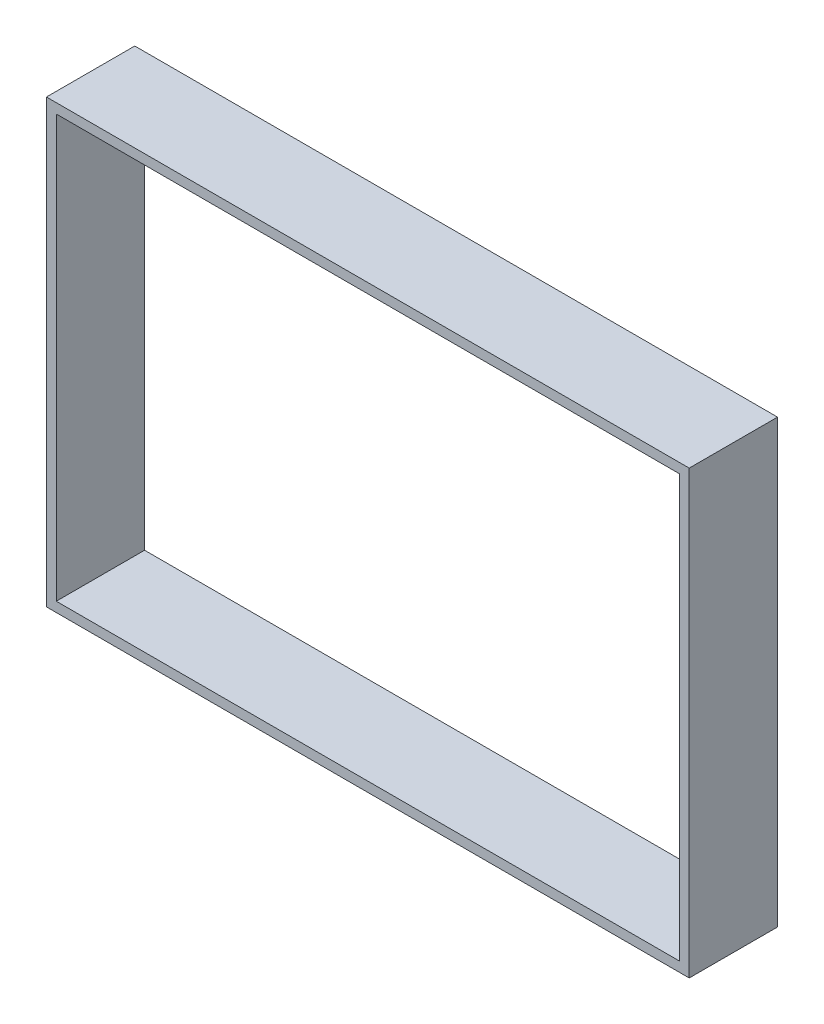
ISO-10303-21;
HEADER;
FILE_DESCRIPTION(('STEP AP214'),'2;1');
FILE_NAME('part.step','',(''),(''),'','','');
FILE_SCHEMA(('AUTOMOTIVE_DESIGN { 1 0 10303 214 1 1 1 1 }'));
ENDSEC;
DATA;
#1=APPLICATION_CONTEXT('core data for automotive mechanical design processes');
#2=APPLICATION_PROTOCOL_DEFINITION('international standard','automotive_design',2000,#1);
#3=PRODUCT_CONTEXT('',#1,'mechanical');
#4=PRODUCT('Part','Part','',(#3));
#5=PRODUCT_RELATED_PRODUCT_CATEGORY('part','',(#4));
#6=PRODUCT_DEFINITION_FORMATION('','',#4);
#7=PRODUCT_DEFINITION_CONTEXT('part definition',#1,'design');
#8=PRODUCT_DEFINITION('design','',#6,#7);
#9=PRODUCT_DEFINITION_SHAPE('','',#8);
#10=(LENGTH_UNIT() NAMED_UNIT(*) SI_UNIT(.MILLI.,.METRE.));
#11=(NAMED_UNIT(*) PLANE_ANGLE_UNIT() SI_UNIT($,.RADIAN.));
#12=(NAMED_UNIT(*) SI_UNIT($,.STERADIAN.) SOLID_ANGLE_UNIT());
#13=UNCERTAINTY_MEASURE_WITH_UNIT(LENGTH_MEASURE(1.E-05),#10,'distance_accuracy_value','');
#14=(GEOMETRIC_REPRESENTATION_CONTEXT(3) GLOBAL_UNCERTAINTY_ASSIGNED_CONTEXT((#13)) GLOBAL_UNIT_ASSIGNED_CONTEXT((#10,
#11,#12)) REPRESENTATION_CONTEXT('',''));
#15=CARTESIAN_POINT('',(0.,0.,0.));
#16=DIRECTION('',(0.,0.,1.));
#17=DIRECTION('',(1.,0.,0.));
#18=AXIS2_PLACEMENT_3D('',#15,#16,#17);
#19=CARTESIAN_POINT('',(0.,0.,18.));
#20=DIRECTION('',(0.,0.,1.));
#21=DIRECTION('',(1.,0.,0.));
#22=AXIS2_PLACEMENT_3D('',#19,#20,#21);
#23=PLANE('',#22);
#24=DIRECTION('',(0.,-1.,0.));
#25=VECTOR('',#24,1.);
#26=CARTESIAN_POINT('',(-70.9068211068211,31.0241956241956,18.));
#27=LINE('',#26,#25);
#28=CARTESIAN_POINT('',(-70.9068211068211,31.0241956241956,18.));
#29=VERTEX_POINT('',#28);
#30=CARTESIAN_POINT('',(-70.9068211068211,-58.9758043758044,18.));
#31=VERTEX_POINT('',#30);
#32=EDGE_CURVE('E157',#29,#31,#27,.T.);
#33=ORIENTED_EDGE('',*,*,#32,.T.);
#34=DIRECTION('',(1.,0.,0.));
#35=VECTOR('',#34,1.);
#36=CARTESIAN_POINT('',(-70.9068211068211,-58.9758043758044,18.));
#37=LINE('',#36,#35);
#38=CARTESIAN_POINT('',(60.0931788931789,-58.9758043758044,18.));
#39=VERTEX_POINT('',#38);
#40=EDGE_CURVE('E161',#31,#39,#37,.T.);
#41=ORIENTED_EDGE('',*,*,#40,.T.);
#42=DIRECTION('',(0.,1.,0.));
#43=VECTOR('',#42,1.);
#44=CARTESIAN_POINT('',(60.0931788931789,31.0241956241956,18.));
#45=LINE('',#44,#43);
#46=CARTESIAN_POINT('',(60.0931788931789,31.0241956241956,18.));
#47=VERTEX_POINT('',#46);
#48=EDGE_CURVE('E165',#39,#47,#45,.T.);
#49=ORIENTED_EDGE('',*,*,#48,.T.);
#50=DIRECTION('',(-1.,0.,0.));
#51=VECTOR('',#50,1.);
#52=CARTESIAN_POINT('',(-70.9068211068211,31.0241956241956,18.));
#53=LINE('',#52,#51);
#54=EDGE_CURVE('E168',#47,#29,#53,.T.);
#55=ORIENTED_EDGE('',*,*,#54,.T.);
#56=EDGE_LOOP('',(#33,#41,#49,#55));
#57=FACE_BOUND('',#56,.T.);
#58=DIRECTION('',(1.,0.,0.));
#59=VECTOR('',#58,1.);
#60=CARTESIAN_POINT('',(-68.9068211068211,-56.9758043758044,18.));
#61=LINE('',#60,#59);
#62=CARTESIAN_POINT('',(-68.9068211068211,-56.9758043758044,18.));
#63=VERTEX_POINT('',#62);
#64=CARTESIAN_POINT('',(58.0931788931789,-56.9758043758044,18.));
#65=VERTEX_POINT('',#64);
#66=EDGE_CURVE('E118',#63,#65,#61,.T.);
#67=ORIENTED_EDGE('',*,*,#66,.F.);
#68=DIRECTION('',(0.,-1.,0.));
#69=VECTOR('',#68,1.);
#70=CARTESIAN_POINT('',(-68.9068211068211,29.0241956241956,18.));
#71=LINE('',#70,#69);
#72=CARTESIAN_POINT('',(-68.9068211068211,29.0241956241956,18.));
#73=VERTEX_POINT('',#72);
#74=EDGE_CURVE('E109',#73,#63,#71,.T.);
#75=ORIENTED_EDGE('',*,*,#74,.F.);
#76=DIRECTION('',(-1.,0.,0.));
#77=VECTOR('',#76,1.);
#78=CARTESIAN_POINT('',(-68.9068211068211,29.0241956241956,18.));
#79=LINE('',#78,#77);
#80=CARTESIAN_POINT('',(58.0931788931789,29.0241956241956,18.));
#81=VERTEX_POINT('',#80);
#82=EDGE_CURVE('E135',#81,#73,#79,.T.);
#83=ORIENTED_EDGE('',*,*,#82,.F.);
#84=DIRECTION('',(0.,1.,0.));
#85=VECTOR('',#84,1.);
#86=CARTESIAN_POINT('',(58.0931788931789,29.0241956241956,18.));
#87=LINE('',#86,#85);
#88=EDGE_CURVE('E131',#65,#81,#87,.T.);
#89=ORIENTED_EDGE('',*,*,#88,.F.);
#90=EDGE_LOOP('',(#67,#75,#83,#89));
#91=FACE_BOUND('',#90,.T.);
#92=ADVANCED_FACE('F43',(#57,#91),#23,.T.);
#93=CARTESIAN_POINT('',(0.,0.,0.));
#94=DIRECTION('',(0.,0.,1.));
#95=DIRECTION('',(1.,0.,0.));
#96=AXIS2_PLACEMENT_3D('',#93,#94,#95);
#97=PLANE('',#96);
#98=DIRECTION('',(0.,-1.,0.));
#99=VECTOR('',#98,1.);
#100=CARTESIAN_POINT('',(-70.9068211068211,31.0241956241956,0.));
#101=LINE('',#100,#99);
#102=CARTESIAN_POINT('',(-70.9068211068211,31.0241956241956,0.));
#103=VERTEX_POINT('',#102);
#104=CARTESIAN_POINT('',(-70.9068211068211,-58.9758043758044,0.));
#105=VERTEX_POINT('',#104);
#106=EDGE_CURVE('E127',#103,#105,#101,.T.);
#107=ORIENTED_EDGE('',*,*,#106,.F.);
#108=DIRECTION('',(-1.,0.,0.));
#109=VECTOR('',#108,1.);
#110=CARTESIAN_POINT('',(-70.9068211068211,31.0241956241956,0.));
#111=LINE('',#110,#109);
#112=CARTESIAN_POINT('',(60.0931788931789,31.0241956241956,0.));
#113=VERTEX_POINT('',#112);
#114=EDGE_CURVE('E162',#113,#103,#111,.T.);
#115=ORIENTED_EDGE('',*,*,#114,.F.);
#116=DIRECTION('',(0.,1.,0.));
#117=VECTOR('',#116,1.);
#118=CARTESIAN_POINT('',(60.0931788931789,31.0241956241956,0.));
#119=LINE('',#118,#117);
#120=CARTESIAN_POINT('',(60.0931788931789,-58.9758043758044,0.));
#121=VERTEX_POINT('',#120);
#122=EDGE_CURVE('E178',#121,#113,#119,.T.);
#123=ORIENTED_EDGE('',*,*,#122,.F.);
#124=DIRECTION('',(1.,0.,0.));
#125=VECTOR('',#124,1.);
#126=CARTESIAN_POINT('',(-70.9068211068211,-58.9758043758044,0.));
#127=LINE('',#126,#125);
#128=EDGE_CURVE('E175',#105,#121,#127,.T.);
#129=ORIENTED_EDGE('',*,*,#128,.F.);
#130=EDGE_LOOP('',(#107,#115,#123,#129));
#131=FACE_BOUND('',#130,.T.);
#132=DIRECTION('',(0.,-1.,0.));
#133=VECTOR('',#132,1.);
#134=CARTESIAN_POINT('',(-68.9068211068211,29.0241956241956,0.));
#135=LINE('',#134,#133);
#136=CARTESIAN_POINT('',(-68.9068211068211,29.0241956241956,0.));
#137=VERTEX_POINT('',#136);
#138=CARTESIAN_POINT('',(-68.9068211068211,-56.9758043758044,0.));
#139=VERTEX_POINT('',#138);
#140=EDGE_CURVE('E67',#137,#139,#135,.T.);
#141=ORIENTED_EDGE('',*,*,#140,.T.);
#142=DIRECTION('',(1.,0.,0.));
#143=VECTOR('',#142,1.);
#144=CARTESIAN_POINT('',(-68.9068211068211,-56.9758043758044,0.));
#145=LINE('',#144,#143);
#146=CARTESIAN_POINT('',(58.0931788931789,-56.9758043758044,0.));
#147=VERTEX_POINT('',#146);
#148=EDGE_CURVE('E125',#139,#147,#145,.T.);
#149=ORIENTED_EDGE('',*,*,#148,.T.);
#150=DIRECTION('',(0.,1.,0.));
#151=VECTOR('',#150,1.);
#152=CARTESIAN_POINT('',(58.0931788931789,29.0241956241956,0.));
#153=LINE('',#152,#151);
#154=CARTESIAN_POINT('',(58.0931788931789,29.0241956241956,0.));
#155=VERTEX_POINT('',#154);
#156=EDGE_CURVE('E144',#147,#155,#153,.T.);
#157=ORIENTED_EDGE('',*,*,#156,.T.);
#158=DIRECTION('',(-1.,0.,0.));
#159=VECTOR('',#158,1.);
#160=CARTESIAN_POINT('',(-68.9068211068211,29.0241956241956,0.));
#161=LINE('',#160,#159);
#162=EDGE_CURVE('E119',#155,#137,#161,.T.);
#163=ORIENTED_EDGE('',*,*,#162,.T.);
#164=EDGE_LOOP('',(#141,#149,#157,#163));
#165=FACE_BOUND('',#164,.T.);
#166=ADVANCED_FACE('F201',(#131,#165),#97,.F.);
#167=CARTESIAN_POINT('',(-70.9068211068211,31.0241956241956,18.));
#168=DIRECTION('',(1.,0.,0.));
#169=DIRECTION('',(0.,1.,0.));
#170=AXIS2_PLACEMENT_3D('',#167,#168,#169);
#171=PLANE('',#170);
#172=ORIENTED_EDGE('',*,*,#106,.T.);
#173=DIRECTION('',(0.,0.,-1.));
#174=VECTOR('',#173,1.);
#175=CARTESIAN_POINT('',(-70.9068211068211,-58.9758043758044,18.));
#176=LINE('',#175,#174);
#177=EDGE_CURVE('E11',#31,#105,#176,.T.);
#178=ORIENTED_EDGE('',*,*,#177,.F.);
#179=ORIENTED_EDGE('',*,*,#32,.F.);
#180=DIRECTION('',(0.,0.,-1.));
#181=VECTOR('',#180,1.);
#182=CARTESIAN_POINT('',(-70.9068211068211,31.0241956241956,18.));
#183=LINE('',#182,#181);
#184=EDGE_CURVE('E171',#29,#103,#183,.T.);
#185=ORIENTED_EDGE('',*,*,#184,.T.);
#186=EDGE_LOOP('',(#172,#178,#179,#185));
#187=FACE_BOUND('',#186,.T.);
#188=ADVANCED_FACE('F45',(#187),#171,.F.);
#189=CARTESIAN_POINT('',(-70.9068211068211,-58.9758043758044,18.));
#190=DIRECTION('',(0.,1.,0.));
#191=DIRECTION('',(0.,0.,1.));
#192=AXIS2_PLACEMENT_3D('',#189,#190,#191);
#193=PLANE('',#192);
#194=ORIENTED_EDGE('',*,*,#128,.T.);
#195=DIRECTION('',(0.,0.,-1.));
#196=VECTOR('',#195,1.);
#197=CARTESIAN_POINT('',(60.0931788931789,-58.9758043758044,18.));
#198=LINE('',#197,#196);
#199=EDGE_CURVE('E52',#39,#121,#198,.T.);
#200=ORIENTED_EDGE('',*,*,#199,.F.);
#201=ORIENTED_EDGE('',*,*,#40,.F.);
#202=ORIENTED_EDGE('',*,*,#177,.T.);
#203=EDGE_LOOP('',(#194,#200,#201,#202));
#204=FACE_BOUND('',#203,.T.);
#205=ADVANCED_FACE('F211',(#204),#193,.F.);
#206=CARTESIAN_POINT('',(60.0931788931789,31.0241956241956,18.));
#207=DIRECTION('',(-1.,0.,0.));
#208=DIRECTION('',(0.,-1.,0.));
#209=AXIS2_PLACEMENT_3D('',#206,#207,#208);
#210=PLANE('',#209);
#211=ORIENTED_EDGE('',*,*,#122,.T.);
#212=DIRECTION('',(0.,0.,-1.));
#213=VECTOR('',#212,1.);
#214=CARTESIAN_POINT('',(60.0931788931789,31.0241956241956,18.));
#215=LINE('',#214,#213);
#216=EDGE_CURVE('E186',#47,#113,#215,.T.);
#217=ORIENTED_EDGE('',*,*,#216,.F.);
#218=ORIENTED_EDGE('',*,*,#48,.F.);
#219=ORIENTED_EDGE('',*,*,#199,.T.);
#220=EDGE_LOOP('',(#211,#217,#218,#219));
#221=FACE_BOUND('',#220,.T.);
#222=ADVANCED_FACE('F195',(#221),#210,.F.);
#223=CARTESIAN_POINT('',(-70.9068211068211,31.0241956241956,18.));
#224=DIRECTION('',(0.,-1.,0.));
#225=DIRECTION('',(1.,0.,0.));
#226=AXIS2_PLACEMENT_3D('',#223,#224,#225);
#227=PLANE('',#226);
#228=ORIENTED_EDGE('',*,*,#114,.T.);
#229=ORIENTED_EDGE('',*,*,#184,.F.);
#230=ORIENTED_EDGE('',*,*,#54,.F.);
#231=ORIENTED_EDGE('',*,*,#216,.T.);
#232=EDGE_LOOP('',(#228,#229,#230,#231));
#233=FACE_BOUND('',#232,.T.);
#234=ADVANCED_FACE('F205',(#233),#227,.F.);
#235=CARTESIAN_POINT('',(-68.9068211068211,29.0241956241956,18.));
#236=DIRECTION('',(1.,0.,0.));
#237=DIRECTION('',(0.,1.,0.));
#238=AXIS2_PLACEMENT_3D('',#235,#236,#237);
#239=PLANE('',#238);
#240=ORIENTED_EDGE('',*,*,#140,.F.);
#241=DIRECTION('',(0.,0.,-1.));
#242=VECTOR('',#241,1.);
#243=CARTESIAN_POINT('',(-68.9068211068211,29.0241956241956,18.));
#244=LINE('',#243,#242);
#245=EDGE_CURVE('E113',#73,#137,#244,.T.);
#246=ORIENTED_EDGE('',*,*,#245,.F.);
#247=ORIENTED_EDGE('',*,*,#74,.T.);
#248=DIRECTION('',(0.,0.,-1.));
#249=VECTOR('',#248,1.);
#250=CARTESIAN_POINT('',(-68.9068211068211,-56.9758043758044,18.));
#251=LINE('',#250,#249);
#252=EDGE_CURVE('E112',#63,#139,#251,.T.);
#253=ORIENTED_EDGE('',*,*,#252,.T.);
#254=EDGE_LOOP('',(#240,#246,#247,#253));
#255=FACE_BOUND('',#254,.T.);
#256=ADVANCED_FACE('F111',(#255),#239,.T.);
#257=CARTESIAN_POINT('',(-68.9068211068211,-56.9758043758044,18.));
#258=DIRECTION('',(0.,1.,0.));
#259=DIRECTION('',(0.,0.,1.));
#260=AXIS2_PLACEMENT_3D('',#257,#258,#259);
#261=PLANE('',#260);
#262=ORIENTED_EDGE('',*,*,#148,.F.);
#263=ORIENTED_EDGE('',*,*,#252,.F.);
#264=ORIENTED_EDGE('',*,*,#66,.T.);
#265=DIRECTION('',(0.,0.,-1.));
#266=VECTOR('',#265,1.);
#267=CARTESIAN_POINT('',(58.0931788931789,-56.9758043758044,18.));
#268=LINE('',#267,#266);
#269=EDGE_CURVE('E128',#65,#147,#268,.T.);
#270=ORIENTED_EDGE('',*,*,#269,.T.);
#271=EDGE_LOOP('',(#262,#263,#264,#270));
#272=FACE_BOUND('',#271,.T.);
#273=ADVANCED_FACE('F122',(#272),#261,.T.);
#274=CARTESIAN_POINT('',(58.0931788931789,29.0241956241956,18.));
#275=DIRECTION('',(-1.,0.,0.));
#276=DIRECTION('',(0.,-1.,0.));
#277=AXIS2_PLACEMENT_3D('',#274,#275,#276);
#278=PLANE('',#277);
#279=ORIENTED_EDGE('',*,*,#156,.F.);
#280=ORIENTED_EDGE('',*,*,#269,.F.);
#281=ORIENTED_EDGE('',*,*,#88,.T.);
#282=DIRECTION('',(0.,0.,-1.));
#283=VECTOR('',#282,1.);
#284=CARTESIAN_POINT('',(58.0931788931789,29.0241956241956,18.));
#285=LINE('',#284,#283);
#286=EDGE_CURVE('E59',#81,#155,#285,.T.);
#287=ORIENTED_EDGE('',*,*,#286,.T.);
#288=EDGE_LOOP('',(#279,#280,#281,#287));
#289=FACE_BOUND('',#288,.T.);
#290=ADVANCED_FACE('F234',(#289),#278,.T.);
#291=CARTESIAN_POINT('',(-68.9068211068211,29.0241956241956,18.));
#292=DIRECTION('',(0.,-1.,0.));
#293=DIRECTION('',(1.,0.,0.));
#294=AXIS2_PLACEMENT_3D('',#291,#292,#293);
#295=PLANE('',#294);
#296=ORIENTED_EDGE('',*,*,#162,.F.);
#297=ORIENTED_EDGE('',*,*,#286,.F.);
#298=ORIENTED_EDGE('',*,*,#82,.T.);
#299=ORIENTED_EDGE('',*,*,#245,.T.);
#300=EDGE_LOOP('',(#296,#297,#298,#299));
#301=FACE_BOUND('',#300,.T.);
#302=ADVANCED_FACE('F238',(#301),#295,.T.);
#303=CLOSED_SHELL('',(#92,#166,#188,#205,#222,#234,#256,#273,#290,#302));
#304=MANIFOLD_SOLID_BREP('B2',#303);
#305=ADVANCED_BREP_SHAPE_REPRESENTATION('',(#18,#304),#14);
#306=SHAPE_DEFINITION_REPRESENTATION(#9,#305);
ENDSEC;
END-ISO-10303-21;
